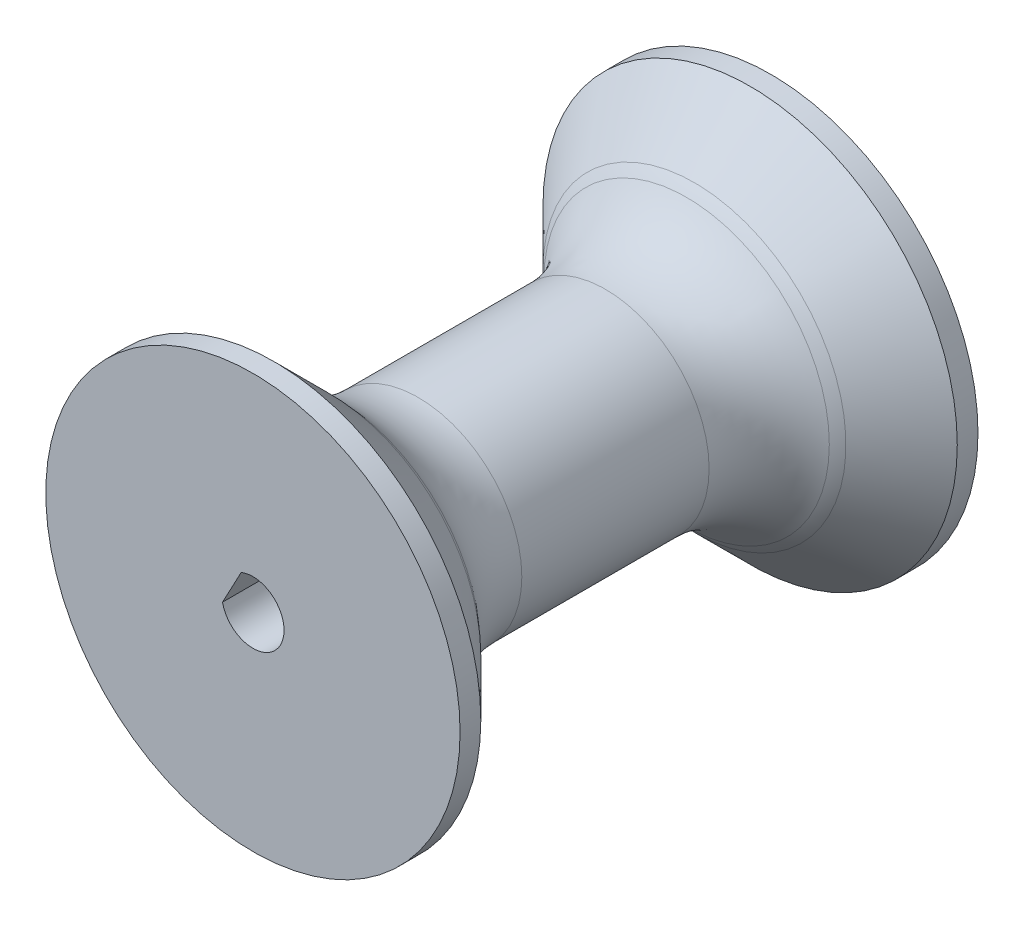
ISO-10303-21;
HEADER;
FILE_DESCRIPTION(('STEP AP214'),'2;1');
FILE_NAME('part.step','',(''),(''),'','','');
FILE_SCHEMA(('AUTOMOTIVE_DESIGN { 1 0 10303 214 1 1 1 1 }'));
ENDSEC;
DATA;
#1=APPLICATION_CONTEXT('core data for automotive mechanical design processes');
#2=APPLICATION_PROTOCOL_DEFINITION('international standard','automotive_design',2000,#1);
#3=PRODUCT_CONTEXT('',#1,'mechanical');
#4=PRODUCT('Part','Part','',(#3));
#5=PRODUCT_RELATED_PRODUCT_CATEGORY('part','',(#4));
#6=PRODUCT_DEFINITION_FORMATION('','',#4);
#7=PRODUCT_DEFINITION_CONTEXT('part definition',#1,'design');
#8=PRODUCT_DEFINITION('design','',#6,#7);
#9=PRODUCT_DEFINITION_SHAPE('','',#8);
#10=(LENGTH_UNIT() NAMED_UNIT(*) SI_UNIT(.MILLI.,.METRE.));
#11=(NAMED_UNIT(*) PLANE_ANGLE_UNIT() SI_UNIT($,.RADIAN.));
#12=(NAMED_UNIT(*) SI_UNIT($,.STERADIAN.) SOLID_ANGLE_UNIT());
#13=UNCERTAINTY_MEASURE_WITH_UNIT(LENGTH_MEASURE(1.E-05),#10,'distance_accuracy_value','');
#14=(GEOMETRIC_REPRESENTATION_CONTEXT(3) GLOBAL_UNCERTAINTY_ASSIGNED_CONTEXT((#13)) GLOBAL_UNIT_ASSIGNED_CONTEXT((#10,
#11,#12)) REPRESENTATION_CONTEXT('',''));
#15=CARTESIAN_POINT('',(0.,0.,0.));
#16=DIRECTION('',(0.,0.,1.));
#17=DIRECTION('',(1.,0.,0.));
#18=AXIS2_PLACEMENT_3D('',#15,#16,#17);
#19=CARTESIAN_POINT('',(0.,0.,5.));
#20=DIRECTION('',(0.,0.,-1.));
#21=DIRECTION('',(-1.,0.,0.));
#22=AXIS2_PLACEMENT_3D('',#19,#20,#21);
#23=CYLINDRICAL_SURFACE('',#22,10.);
#24=CARTESIAN_POINT('',(0.,0.,0.999999999999996));
#25=DIRECTION('',(0.,0.,1.));
#26=DIRECTION('',(1.,0.,0.));
#27=AXIS2_PLACEMENT_3D('',#24,#25,#26);
#28=CIRCLE('',#27,10.);
#29=CARTESIAN_POINT('',(10.,0.,0.999999999999996));
#30=VERTEX_POINT('',#29);
#31=EDGE_CURVE('E94',#30,#30,#28,.F.);
#32=ORIENTED_EDGE('',*,*,#31,.T.);
#33=EDGE_LOOP('',(#32));
#34=FACE_BOUND('',#33,.T.);
#35=CARTESIAN_POINT('',(0.,0.,0.));
#36=DIRECTION('',(0.,0.,1.));
#37=DIRECTION('',(1.,0.,0.));
#38=AXIS2_PLACEMENT_3D('',#35,#36,#37);
#39=CIRCLE('',#38,10.);
#40=CARTESIAN_POINT('',(10.,0.,0.));
#41=VERTEX_POINT('',#40);
#42=EDGE_CURVE('E85',#41,#41,#39,.T.);
#43=ORIENTED_EDGE('',*,*,#42,.T.);
#44=EDGE_LOOP('',(#43));
#45=FACE_BOUND('',#44,.T.);
#46=ADVANCED_FACE('F39',(#34,#45),#23,.T.);
#47=CARTESIAN_POINT('',(0.,0.,0.));
#48=DIRECTION('',(0.,0.,1.));
#49=DIRECTION('',(1.,0.,0.));
#50=AXIS2_PLACEMENT_3D('',#47,#48,#49);
#51=PLANE('',#50);
#52=DIRECTION('',(0.470101705038366,0.882612251739132,0.));
#53=VECTOR('',#52,1.);
#54=CARTESIAN_POINT('',(-0.567187137377976,1.38863197111149,0.));
#55=LINE('',#54,#53);
#56=CARTESIAN_POINT('',(-1.46883087866287,-0.304197057655826,0.));
#57=VERTEX_POINT('',#56);
#58=CARTESIAN_POINT('',(-0.567187137377976,1.38863197111149,0.));
#59=VERTEX_POINT('',#58);
#60=EDGE_CURVE('E74',#57,#59,#55,.T.);
#61=ORIENTED_EDGE('',*,*,#60,.F.);
#62=CARTESIAN_POINT('',(0.,0.,0.));
#63=DIRECTION('',(0.,0.,-1.));
#64=DIRECTION('',(-1.,0.,0.));
#65=AXIS2_PLACEMENT_3D('',#62,#63,#64);
#66=CIRCLE('',#65,1.5);
#67=EDGE_CURVE('E54',#59,#57,#66,.T.);
#68=ORIENTED_EDGE('',*,*,#67,.F.);
#69=EDGE_LOOP('',(#61,#68));
#70=FACE_BOUND('',#69,.T.);
#71=ORIENTED_EDGE('',*,*,#42,.F.);
#72=EDGE_LOOP('',(#71));
#73=FACE_BOUND('',#72,.T.);
#74=ADVANCED_FACE('F78',(#70,#73),#51,.F.);
#75=CARTESIAN_POINT('',(0.,0.,20.));
#76=DIRECTION('',(0.,0.,-1.));
#77=DIRECTION('',(-1.,0.,0.));
#78=AXIS2_PLACEMENT_3D('',#75,#76,#77);
#79=CYLINDRICAL_SURFACE('',#78,5.);
#80=CARTESIAN_POINT('',(0.,0.,17.02029383399));
#81=DIRECTION('',(0.,0.,1.));
#82=DIRECTION('',(1.,0.,0.));
#83=AXIS2_PLACEMENT_3D('',#80,#81,#82);
#84=CIRCLE('',#83,5.);
#85=CARTESIAN_POINT('',(5.,0.,17.02029383399));
#86=VERTEX_POINT('',#85);
#87=EDGE_CURVE('E47',#86,#86,#84,.F.);
#88=ORIENTED_EDGE('',*,*,#87,.T.);
#89=EDGE_LOOP('',(#88));
#90=FACE_BOUND('',#89,.T.);
#91=CARTESIAN_POINT('',(0.,0.,7.97970616601002));
#92=DIRECTION('',(0.,0.,1.));
#93=DIRECTION('',(1.,0.,0.));
#94=AXIS2_PLACEMENT_3D('',#91,#92,#93);
#95=CIRCLE('',#94,5.);
#96=CARTESIAN_POINT('',(5.,0.,7.97970616601002));
#97=VERTEX_POINT('',#96);
#98=EDGE_CURVE('E106',#97,#97,#95,.T.);
#99=ORIENTED_EDGE('',*,*,#98,.T.);
#100=EDGE_LOOP('',(#99));
#101=FACE_BOUND('',#100,.T.);
#102=ADVANCED_FACE('F111',(#90,#101),#79,.T.);
#103=CARTESIAN_POINT('',(0.,0.,25.));
#104=DIRECTION('',(0.,0.,-1.));
#105=DIRECTION('',(-1.,0.,0.));
#106=AXIS2_PLACEMENT_3D('',#103,#104,#105);
#107=CYLINDRICAL_SURFACE('',#106,10.);
#108=CARTESIAN_POINT('',(0.,0.,24.));
#109=DIRECTION('',(0.,0.,1.));
#110=DIRECTION('',(1.,0.,0.));
#111=AXIS2_PLACEMENT_3D('',#108,#109,#110);
#112=CIRCLE('',#111,10.);
#113=CARTESIAN_POINT('',(10.,0.,24.));
#114=VERTEX_POINT('',#113);
#115=EDGE_CURVE('E91',#114,#114,#112,.T.);
#116=ORIENTED_EDGE('',*,*,#115,.T.);
#117=EDGE_LOOP('',(#116));
#118=FACE_BOUND('',#117,.T.);
#119=CARTESIAN_POINT('',(0.,0.,25.));
#120=DIRECTION('',(0.,0.,1.));
#121=DIRECTION('',(1.,0.,0.));
#122=AXIS2_PLACEMENT_3D('',#119,#120,#121);
#123=CIRCLE('',#122,10.);
#124=CARTESIAN_POINT('',(10.,0.,25.));
#125=VERTEX_POINT('',#124);
#126=EDGE_CURVE('E70',#125,#125,#123,.T.);
#127=ORIENTED_EDGE('',*,*,#126,.F.);
#128=EDGE_LOOP('',(#127));
#129=FACE_BOUND('',#128,.T.);
#130=ADVANCED_FACE('F133',(#118,#129),#107,.T.);
#131=CARTESIAN_POINT('',(0.,0.,25.));
#132=DIRECTION('',(0.,0.,1.));
#133=DIRECTION('',(1.,0.,0.));
#134=AXIS2_PLACEMENT_3D('',#131,#132,#133);
#135=PLANE('',#134);
#136=CARTESIAN_POINT('',(0.,0.,25.));
#137=DIRECTION('',(0.,0.,1.));
#138=DIRECTION('',(1.,0.,0.));
#139=AXIS2_PLACEMENT_3D('',#136,#137,#138);
#140=CIRCLE('',#139,1.5);
#141=CARTESIAN_POINT('',(-1.46883087866287,-0.304197057655826,25.));
#142=VERTEX_POINT('',#141);
#143=CARTESIAN_POINT('',(-0.567187137377976,1.38863197111149,25.));
#144=VERTEX_POINT('',#143);
#145=EDGE_CURVE('E68',#142,#144,#140,.T.);
#146=ORIENTED_EDGE('',*,*,#145,.F.);
#147=DIRECTION('',(-0.470101705038366,-0.882612251739132,0.));
#148=VECTOR('',#147,1.);
#149=CARTESIAN_POINT('',(-1.01800900802042,0.542217456727831,25.));
#150=LINE('',#149,#148);
#151=EDGE_CURVE('E88',#144,#142,#150,.T.);
#152=ORIENTED_EDGE('',*,*,#151,.F.);
#153=EDGE_LOOP('',(#146,#152));
#154=FACE_BOUND('',#153,.T.);
#155=ORIENTED_EDGE('',*,*,#126,.T.);
#156=EDGE_LOOP('',(#155));
#157=FACE_BOUND('',#156,.T.);
#158=ADVANCED_FACE('F136',(#154,#157),#135,.T.);
#159=CARTESIAN_POINT('',(0.,0.,26.));
#160=DIRECTION('',(0.,0.,-1.));
#161=DIRECTION('',(-1.,0.,0.));
#162=AXIS2_PLACEMENT_3D('',#159,#160,#161);
#163=CYLINDRICAL_SURFACE('',#162,1.5);
#164=ORIENTED_EDGE('',*,*,#145,.T.);
#165=DIRECTION('',(0.,0.,-1.));
#166=VECTOR('',#165,1.);
#167=CARTESIAN_POINT('',(-0.567187137377976,1.38863197111149,26.));
#168=LINE('',#167,#166);
#169=EDGE_CURVE('E61',#144,#59,#168,.T.);
#170=ORIENTED_EDGE('',*,*,#169,.T.);
#171=ORIENTED_EDGE('',*,*,#67,.T.);
#172=DIRECTION('',(0.,0.,-1.));
#173=VECTOR('',#172,1.);
#174=CARTESIAN_POINT('',(-1.46883087866287,-0.304197057655826,26.));
#175=LINE('',#174,#173);
#176=EDGE_CURVE('E71',#142,#57,#175,.T.);
#177=ORIENTED_EDGE('',*,*,#176,.F.);
#178=EDGE_LOOP('',(#164,#170,#171,#177));
#179=FACE_BOUND('',#178,.T.);
#180=ADVANCED_FACE('F66',(#179),#163,.F.);
#181=CARTESIAN_POINT('',(-0.567187137377976,1.38863197111149,26.));
#182=DIRECTION('',(-0.882612251739132,0.470101705038366,0.));
#183=DIRECTION('',(-0.470101705038366,-0.882612251739132,0.));
#184=AXIS2_PLACEMENT_3D('',#181,#182,#183);
#185=PLANE('',#184);
#186=ORIENTED_EDGE('',*,*,#151,.T.);
#187=ORIENTED_EDGE('',*,*,#176,.T.);
#188=ORIENTED_EDGE('',*,*,#60,.T.);
#189=ORIENTED_EDGE('',*,*,#169,.F.);
#190=EDGE_LOOP('',(#186,#187,#188,#189));
#191=FACE_BOUND('',#190,.T.);
#192=ADVANCED_FACE('F75',(#191),#185,.F.);
#193=CARTESIAN_POINT('',(0.,0.,24.));
#194=DIRECTION('',(0.,0.,1.));
#195=DIRECTION('',(1.,0.,0.));
#196=AXIS2_PLACEMENT_3D('',#193,#194,#195);
#197=CONICAL_SURFACE('',#196,10.,0.78539816339745);
#198=CARTESIAN_POINT('',(0.,0.,21.312604177953));
#199=DIRECTION('',(0.,0.,1.));
#200=DIRECTION('',(1.,0.,0.));
#201=AXIS2_PLACEMENT_3D('',#198,#199,#200);
#202=CIRCLE('',#201,7.312604177953);
#203=CARTESIAN_POINT('',(7.312604177953,0.,21.312604177953));
#204=VERTEX_POINT('',#203);
#205=EDGE_CURVE('E97',#204,#204,#202,.T.);
#206=ORIENTED_EDGE('',*,*,#205,.T.);
#207=EDGE_LOOP('',(#206));
#208=FACE_BOUND('',#207,.T.);
#209=ORIENTED_EDGE('',*,*,#115,.F.);
#210=EDGE_LOOP('',(#209));
#211=FACE_BOUND('',#210,.T.);
#212=ADVANCED_FACE('F127',(#208,#211),#197,.T.);
#213=CARTESIAN_POINT('',(0.,0.,5.));
#214=DIRECTION('',(0.,0.,-1.));
#215=DIRECTION('',(-1.,0.,0.));
#216=AXIS2_PLACEMENT_3D('',#213,#214,#215);
#217=CONICAL_SURFACE('',#216,6.00000000000001,0.785398163397447);
#218=CARTESIAN_POINT('',(0.,0.,3.68739582204698));
#219=DIRECTION('',(0.,0.,-1.));
#220=DIRECTION('',(-1.,0.,0.));
#221=AXIS2_PLACEMENT_3D('',#218,#219,#220);
#222=CIRCLE('',#221,7.31260417795303);
#223=CARTESIAN_POINT('',(-7.31260417795303,0.,3.68739582204698));
#224=VERTEX_POINT('',#223);
#225=EDGE_CURVE('E100',#224,#224,#222,.T.);
#226=ORIENTED_EDGE('',*,*,#225,.T.);
#227=EDGE_LOOP('',(#226));
#228=FACE_BOUND('',#227,.T.);
#229=ORIENTED_EDGE('',*,*,#31,.F.);
#230=EDGE_LOOP('',(#229));
#231=FACE_BOUND('',#230,.T.);
#232=ADVANCED_FACE('F123',(#228,#231),#217,.T.);
#233=CARTESIAN_POINT('',(0.,0.,24.8481380838858));
#234=DIRECTION('',(0.,0.,-1.));
#235=DIRECTION('',(-1.,0.,0.));
#236=AXIS2_PLACEMENT_3D('',#233,#234,#235);
#237=DEGENERATE_TOROIDAL_SURFACE('',#236,3.77707027202027,5.,.T.);
#238=CARTESIAN_POINT('',(0.,0.,20.9342159589379));
#239=DIRECTION('',(0.,0.,1.));
#240=DIRECTION('',(1.,0.,0.));
#241=AXIS2_PLACEMENT_3D('',#238,#239,#240);
#242=CIRCLE('',#241,6.88853513601013);
#243=CARTESIAN_POINT('',(6.88853513601013,0.,20.9342159589379));
#244=VERTEX_POINT('',#243);
#245=EDGE_CURVE('E103',#244,#244,#242,.T.);
#246=ORIENTED_EDGE('',*,*,#245,.T.);
#247=EDGE_LOOP('',(#246));
#248=FACE_BOUND('',#247,.T.);
#249=ORIENTED_EDGE('',*,*,#205,.F.);
#250=EDGE_LOOP('',(#249));
#251=FACE_BOUND('',#250,.T.);
#252=ADVANCED_FACE('F120',(#248,#251),#237,.T.);
#253=CARTESIAN_POINT('',(0.,0.,0.151861916114245));
#254=DIRECTION('',(0.,0.,1.));
#255=DIRECTION('',(1.,0.,0.));
#256=AXIS2_PLACEMENT_3D('',#253,#254,#255);
#257=DEGENERATE_TOROIDAL_SURFACE('',#256,3.77707027202028,5.,.T.);
#258=CARTESIAN_POINT('',(0.,0.,4.06578404106213));
#259=DIRECTION('',(0.,0.,-1.));
#260=DIRECTION('',(-1.,0.,0.));
#261=AXIS2_PLACEMENT_3D('',#258,#259,#260);
#262=CIRCLE('',#261,6.88853513601014);
#263=CARTESIAN_POINT('',(-6.88853513601014,0.,4.06578404106213));
#264=VERTEX_POINT('',#263);
#265=EDGE_CURVE('E11',#264,#264,#262,.T.);
#266=ORIENTED_EDGE('',*,*,#265,.T.);
#267=EDGE_LOOP('',(#266));
#268=FACE_BOUND('',#267,.T.);
#269=ORIENTED_EDGE('',*,*,#225,.F.);
#270=EDGE_LOOP('',(#269));
#271=FACE_BOUND('',#270,.T.);
#272=ADVANCED_FACE('F117',(#268,#271),#257,.T.);
#273=CARTESIAN_POINT('',(0.,0.,17.02029383399));
#274=DIRECTION('',(0.,0.,1.));
#275=DIRECTION('',(1.,0.,0.));
#276=AXIS2_PLACEMENT_3D('',#273,#274,#275);
#277=TOROIDAL_SURFACE('',#276,10.,5.);
#278=ORIENTED_EDGE('',*,*,#87,.F.);
#279=EDGE_LOOP('',(#278));
#280=FACE_BOUND('',#279,.T.);
#281=ORIENTED_EDGE('',*,*,#245,.F.);
#282=EDGE_LOOP('',(#281));
#283=FACE_BOUND('',#282,.T.);
#284=ADVANCED_FACE('F114',(#280,#283),#277,.F.);
#285=CARTESIAN_POINT('',(0.,0.,7.97970616601002));
#286=DIRECTION('',(0.,0.,1.));
#287=DIRECTION('',(1.,0.,0.));
#288=AXIS2_PLACEMENT_3D('',#285,#286,#287);
#289=TOROIDAL_SURFACE('',#288,10.,5.);
#290=ORIENTED_EDGE('',*,*,#265,.F.);
#291=EDGE_LOOP('',(#290));
#292=FACE_BOUND('',#291,.T.);
#293=ORIENTED_EDGE('',*,*,#98,.F.);
#294=EDGE_LOOP('',(#293));
#295=FACE_BOUND('',#294,.T.);
#296=ADVANCED_FACE('F41',(#292,#295),#289,.F.);
#297=CLOSED_SHELL('',(#46,#74,#102,#130,#158,#180,#192,#212,#232,#252,#272,#284,#296));
#298=MANIFOLD_SOLID_BREP('B2',#297);
#299=ADVANCED_BREP_SHAPE_REPRESENTATION('',(#18,#298),#14);
#300=SHAPE_DEFINITION_REPRESENTATION(#9,#299);
ENDSEC;
END-ISO-10303-21;
